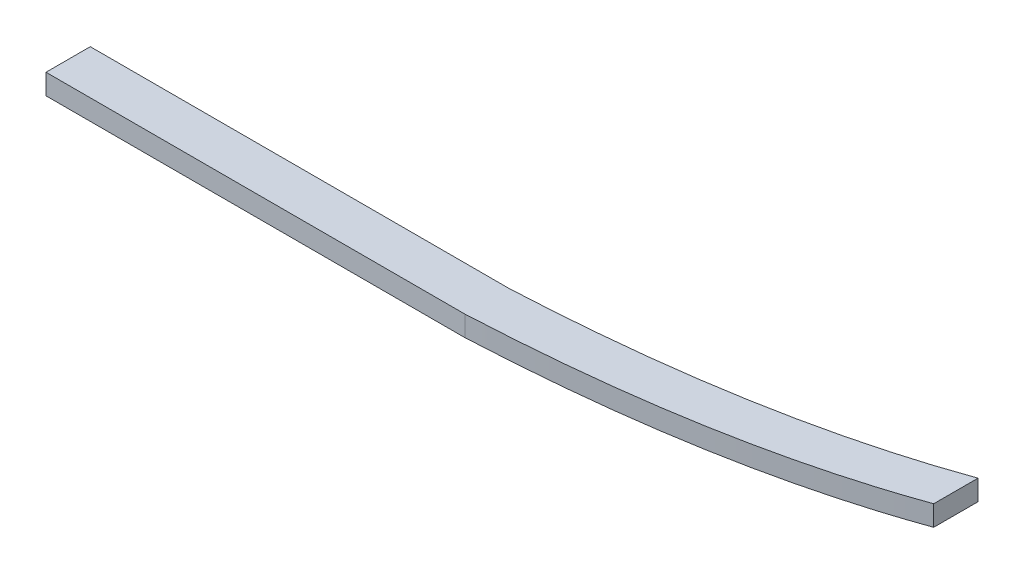
ISO-10303-21;
HEADER;
FILE_DESCRIPTION(('STEP AP214'),'2;1');
FILE_NAME('part.step','',(''),(''),'','','');
FILE_SCHEMA(('AUTOMOTIVE_DESIGN { 1 0 10303 214 1 1 1 1 }'));
ENDSEC;
DATA;
#1=APPLICATION_CONTEXT('core data for automotive mechanical design processes');
#2=APPLICATION_PROTOCOL_DEFINITION('international standard','automotive_design',2000,#1);
#3=PRODUCT_CONTEXT('',#1,'mechanical');
#4=PRODUCT('Part','Part','',(#3));
#5=PRODUCT_RELATED_PRODUCT_CATEGORY('part','',(#4));
#6=PRODUCT_DEFINITION_FORMATION('','',#4);
#7=PRODUCT_DEFINITION_CONTEXT('part definition',#1,'design');
#8=PRODUCT_DEFINITION('design','',#6,#7);
#9=PRODUCT_DEFINITION_SHAPE('','',#8);
#10=(LENGTH_UNIT() NAMED_UNIT(*) SI_UNIT(.MILLI.,.METRE.));
#11=(NAMED_UNIT(*) PLANE_ANGLE_UNIT() SI_UNIT($,.RADIAN.));
#12=(NAMED_UNIT(*) SI_UNIT($,.STERADIAN.) SOLID_ANGLE_UNIT());
#13=UNCERTAINTY_MEASURE_WITH_UNIT(LENGTH_MEASURE(1.E-05),#10,'distance_accuracy_value','');
#14=(GEOMETRIC_REPRESENTATION_CONTEXT(3) GLOBAL_UNCERTAINTY_ASSIGNED_CONTEXT((#13)) GLOBAL_UNIT_ASSIGNED_CONTEXT((#10,
#11,#12)) REPRESENTATION_CONTEXT('',''));
#15=CARTESIAN_POINT('',(0.,0.,0.));
#16=DIRECTION('',(0.,0.,1.));
#17=DIRECTION('',(1.,0.,0.));
#18=AXIS2_PLACEMENT_3D('',#15,#16,#17);
#19=CARTESIAN_POINT('',(0.,3.,0.));
#20=DIRECTION('',(1.,0.,0.));
#21=DIRECTION('',(0.,0.,-1.));
#22=AXIS2_PLACEMENT_3D('',#19,#20,#21);
#23=PLANE('',#22);
#24=DIRECTION('',(0.,0.,1.));
#25=VECTOR('',#24,1.);
#26=CARTESIAN_POINT('',(0.,0.,0.));
#27=LINE('',#26,#25);
#28=CARTESIAN_POINT('',(0.,0.,-6.5));
#29=VERTEX_POINT('',#28);
#30=CARTESIAN_POINT('',(0.,0.,0.));
#31=VERTEX_POINT('',#30);
#32=EDGE_CURVE('E185',#29,#31,#27,.T.);
#33=ORIENTED_EDGE('',*,*,#32,.T.);
#34=DIRECTION('',(0.,-1.,0.));
#35=VECTOR('',#34,1.);
#36=CARTESIAN_POINT('',(0.,3.,0.));
#37=LINE('',#36,#35);
#38=CARTESIAN_POINT('',(0.,3.,0.));
#39=VERTEX_POINT('',#38);
#40=EDGE_CURVE('E11',#39,#31,#37,.T.);
#41=ORIENTED_EDGE('',*,*,#40,.F.);
#42=DIRECTION('',(0.,0.,1.));
#43=VECTOR('',#42,1.);
#44=CARTESIAN_POINT('',(0.,3.,0.));
#45=LINE('',#44,#43);
#46=CARTESIAN_POINT('',(0.,3.,-6.5));
#47=VERTEX_POINT('',#46);
#48=EDGE_CURVE('E156',#47,#39,#45,.T.);
#49=ORIENTED_EDGE('',*,*,#48,.F.);
#50=DIRECTION('',(0.,-1.,0.));
#51=VECTOR('',#50,1.);
#52=CARTESIAN_POINT('',(0.,3.,-6.5));
#53=LINE('',#52,#51);
#54=EDGE_CURVE('E124',#47,#29,#53,.T.);
#55=ORIENTED_EDGE('',*,*,#54,.T.);
#56=EDGE_LOOP('',(#33,#41,#49,#55));
#57=FACE_BOUND('',#56,.T.);
#58=ADVANCED_FACE('F39',(#57),#23,.F.);
#59=CARTESIAN_POINT('',(0.,3.,0.));
#60=DIRECTION('',(0.,0.,-1.));
#61=DIRECTION('',(-1.,0.,0.));
#62=AXIS2_PLACEMENT_3D('',#59,#60,#61);
#63=PLANE('',#62);
#64=DIRECTION('',(1.,0.,0.));
#65=VECTOR('',#64,1.);
#66=CARTESIAN_POINT('',(0.,0.,0.));
#67=LINE('',#66,#65);
#68=CARTESIAN_POINT('',(61.5,0.,0.));
#69=VERTEX_POINT('',#68);
#70=EDGE_CURVE('E180',#31,#69,#67,.T.);
#71=ORIENTED_EDGE('',*,*,#70,.T.);
#72=DIRECTION('',(0.,-1.,0.));
#73=VECTOR('',#72,1.);
#74=CARTESIAN_POINT('',(61.5,3.,0.));
#75=LINE('',#74,#73);
#76=CARTESIAN_POINT('',(61.5,3.,0.));
#77=VERTEX_POINT('',#76);
#78=EDGE_CURVE('E48',#77,#69,#75,.T.);
#79=ORIENTED_EDGE('',*,*,#78,.F.);
#80=DIRECTION('',(1.,0.,0.));
#81=VECTOR('',#80,1.);
#82=CARTESIAN_POINT('',(0.,3.,0.));
#83=LINE('',#82,#81);
#84=EDGE_CURVE('E93',#39,#77,#83,.T.);
#85=ORIENTED_EDGE('',*,*,#84,.F.);
#86=ORIENTED_EDGE('',*,*,#40,.T.);
#87=EDGE_LOOP('',(#71,#79,#85,#86));
#88=FACE_BOUND('',#87,.T.);
#89=ADVANCED_FACE('F144',(#88),#63,.F.);
#90=CARTESIAN_POINT('',(61.5,3.,0.));
#91=CARTESIAN_POINT('',(96.0798685763207,3.,-1.68994550364377));
#92=CARTESIAN_POINT('',(120.026085552251,3.,-10.3));
#93=B_SPLINE_CURVE_WITH_KNOTS('',2,(#90,#91,#92),.UNSPECIFIED.,.F.,.F.,(3,3),(0.,1.),.UNSPECIFIED.);
#94=DIRECTION('',(0.,-1.,0.));
#95=VECTOR('',#94,1.);
#96=SURFACE_OF_LINEAR_EXTRUSION('',#93,#95);
#97=CARTESIAN_POINT('',(61.5,0.,0.));
#98=CARTESIAN_POINT('',(96.0798685763207,0.,-1.68994550364377));
#99=CARTESIAN_POINT('',(120.026085552251,0.,-10.3));
#100=B_SPLINE_CURVE_WITH_KNOTS('',2,(#97,#98,#99),.UNSPECIFIED.,.F.,.F.,(3,3),(0.,1.),.UNSPECIFIED.);
#101=CARTESIAN_POINT('',(120.026085552251,0.,-10.3));
#102=VERTEX_POINT('',#101);
#103=EDGE_CURVE('E176',#69,#102,#100,.T.);
#104=ORIENTED_EDGE('',*,*,#103,.T.);
#105=DIRECTION('',(0.,-1.,0.));
#106=VECTOR('',#105,1.);
#107=CARTESIAN_POINT('',(120.026085552251,3.,-10.3));
#108=LINE('',#107,#106);
#109=CARTESIAN_POINT('',(120.026085552251,3.,-10.3));
#110=VERTEX_POINT('',#109);
#111=EDGE_CURVE('E117',#110,#102,#108,.T.);
#112=ORIENTED_EDGE('',*,*,#111,.F.);
#113=EDGE_CURVE('E106',#77,#110,#93,.T.);
#114=ORIENTED_EDGE('',*,*,#113,.F.);
#115=ORIENTED_EDGE('',*,*,#78,.T.);
#116=EDGE_LOOP('',(#104,#112,#114,#115));
#117=FACE_BOUND('',#116,.T.);
#118=ADVANCED_FACE('F142',(#117),#96,.F.);
#119=CARTESIAN_POINT('',(120.026085552251,3.,-10.3));
#120=DIRECTION('',(-0.999999915307352,0.,-0.000411564441629204));
#121=DIRECTION('',(-0.000411564441629204,0.,0.999999915307352));
#122=AXIS2_PLACEMENT_3D('',#119,#120,#121);
#123=PLANE('',#122);
#124=DIRECTION('',(0.000411564441629204,0.,-0.999999915307352));
#125=VECTOR('',#124,1.);
#126=CARTESIAN_POINT('',(120.026085552251,0.,-10.3));
#127=LINE('',#126,#125);
#128=CARTESIAN_POINT('',(120.028762052625,0.,-16.8032346736297));
#129=VERTEX_POINT('',#128);
#130=EDGE_CURVE('E115',#102,#129,#127,.T.);
#131=ORIENTED_EDGE('',*,*,#130,.T.);
#132=DIRECTION('',(0.,-1.,0.));
#133=VECTOR('',#132,1.);
#134=CARTESIAN_POINT('',(120.028762052625,3.,-16.8032346736297));
#135=LINE('',#134,#133);
#136=CARTESIAN_POINT('',(120.028762052625,3.,-16.8032346736297));
#137=VERTEX_POINT('',#136);
#138=EDGE_CURVE('E112',#137,#129,#135,.T.);
#139=ORIENTED_EDGE('',*,*,#138,.F.);
#140=DIRECTION('',(0.000411564441629204,0.,-0.999999915307352));
#141=VECTOR('',#140,1.);
#142=CARTESIAN_POINT('',(120.026085552251,3.,-10.3));
#143=LINE('',#142,#141);
#144=EDGE_CURVE('E100',#110,#137,#143,.T.);
#145=ORIENTED_EDGE('',*,*,#144,.F.);
#146=ORIENTED_EDGE('',*,*,#111,.T.);
#147=EDGE_LOOP('',(#131,#139,#145,#146));
#148=FACE_BOUND('',#147,.T.);
#149=ADVANCED_FACE('F113',(#148),#123,.F.);
#150=CARTESIAN_POINT('',(120.028762052625,3.,-16.8032346736297));
#151=CARTESIAN_POINT('',(96.0825450766947,3.,-8.19318017727344));
#152=CARTESIAN_POINT('',(61.5,3.,-6.5));
#153=B_SPLINE_CURVE_WITH_KNOTS('',2,(#150,#151,#152),.UNSPECIFIED.,.F.,.F.,(3,3),(0.,1.),.UNSPECIFIED.);
#154=DIRECTION('',(0.,-1.,0.));
#155=VECTOR('',#154,1.);
#156=SURFACE_OF_LINEAR_EXTRUSION('',#153,#155);
#157=CARTESIAN_POINT('',(120.028762052625,0.,-16.8032346736297));
#158=CARTESIAN_POINT('',(96.0825450766947,0.,-8.19318017727344));
#159=CARTESIAN_POINT('',(61.5,0.,-6.5));
#160=B_SPLINE_CURVE_WITH_KNOTS('',2,(#157,#158,#159),.UNSPECIFIED.,.F.,.F.,(3,3),(0.,1.),.UNSPECIFIED.);
#161=CARTESIAN_POINT('',(61.5,0.,-6.5));
#162=VERTEX_POINT('',#161);
#163=EDGE_CURVE('E79',#129,#162,#160,.T.);
#164=ORIENTED_EDGE('',*,*,#163,.T.);
#165=DIRECTION('',(0.,-1.,0.));
#166=VECTOR('',#165,1.);
#167=CARTESIAN_POINT('',(61.5,3.,-6.5));
#168=LINE('',#167,#166);
#169=CARTESIAN_POINT('',(61.5,3.,-6.5));
#170=VERTEX_POINT('',#169);
#171=EDGE_CURVE('E118',#170,#162,#168,.T.);
#172=ORIENTED_EDGE('',*,*,#171,.F.);
#173=EDGE_CURVE('E104',#137,#170,#153,.T.);
#174=ORIENTED_EDGE('',*,*,#173,.F.);
#175=ORIENTED_EDGE('',*,*,#138,.T.);
#176=EDGE_LOOP('',(#164,#172,#174,#175));
#177=FACE_BOUND('',#176,.T.);
#178=ADVANCED_FACE('F120',(#177),#156,.F.);
#179=CARTESIAN_POINT('',(0.,3.,-6.5));
#180=DIRECTION('',(0.,0.,1.));
#181=DIRECTION('',(1.,0.,0.));
#182=AXIS2_PLACEMENT_3D('',#179,#180,#181);
#183=PLANE('',#182);
#184=DIRECTION('',(-1.,0.,0.));
#185=VECTOR('',#184,1.);
#186=CARTESIAN_POINT('',(0.,0.,-6.5));
#187=LINE('',#186,#185);
#188=EDGE_CURVE('E85',#162,#29,#187,.T.);
#189=ORIENTED_EDGE('',*,*,#188,.T.);
#190=ORIENTED_EDGE('',*,*,#54,.F.);
#191=DIRECTION('',(-1.,0.,0.));
#192=VECTOR('',#191,1.);
#193=CARTESIAN_POINT('',(0.,3.,-6.5));
#194=LINE('',#193,#192);
#195=EDGE_CURVE('E56',#170,#47,#194,.T.);
#196=ORIENTED_EDGE('',*,*,#195,.F.);
#197=ORIENTED_EDGE('',*,*,#171,.T.);
#198=EDGE_LOOP('',(#189,#190,#196,#197));
#199=FACE_BOUND('',#198,.T.);
#200=ADVANCED_FACE('F138',(#199),#183,.F.);
#201=CARTESIAN_POINT('',(93.4234630515037,3.,-9.92239875704414));
#202=DIRECTION('',(0.,-1.,0.));
#203=DIRECTION('',(0.,0.,-1.));
#204=AXIS2_PLACEMENT_3D('',#201,#202,#203);
#205=PLANE('',#204);
#206=ORIENTED_EDGE('',*,*,#48,.T.);
#207=ORIENTED_EDGE('',*,*,#84,.T.);
#208=ORIENTED_EDGE('',*,*,#113,.T.);
#209=ORIENTED_EDGE('',*,*,#144,.T.);
#210=ORIENTED_EDGE('',*,*,#173,.T.);
#211=ORIENTED_EDGE('',*,*,#195,.T.);
#212=EDGE_LOOP('',(#206,#207,#208,#209,#210,#211));
#213=FACE_BOUND('',#212,.T.);
#214=ADVANCED_FACE('F102',(#213),#205,.F.);
#215=CARTESIAN_POINT('',(93.4234630515037,0.,-9.92239875704414));
#216=DIRECTION('',(0.,-1.,0.));
#217=DIRECTION('',(0.,0.,-1.));
#218=AXIS2_PLACEMENT_3D('',#215,#216,#217);
#219=PLANE('',#218);
#220=ORIENTED_EDGE('',*,*,#32,.F.);
#221=ORIENTED_EDGE('',*,*,#188,.F.);
#222=ORIENTED_EDGE('',*,*,#163,.F.);
#223=ORIENTED_EDGE('',*,*,#130,.F.);
#224=ORIENTED_EDGE('',*,*,#103,.F.);
#225=ORIENTED_EDGE('',*,*,#70,.F.);
#226=EDGE_LOOP('',(#220,#221,#222,#223,#224,#225));
#227=FACE_BOUND('',#226,.T.);
#228=ADVANCED_FACE('F179',(#227),#219,.T.);
#229=CLOSED_SHELL('',(#58,#89,#118,#149,#178,#200,#214,#228));
#230=MANIFOLD_SOLID_BREP('B2',#229);
#231=ADVANCED_BREP_SHAPE_REPRESENTATION('',(#18,#230),#14);
#232=SHAPE_DEFINITION_REPRESENTATION(#9,#231);
ENDSEC;
END-ISO-10303-21;
